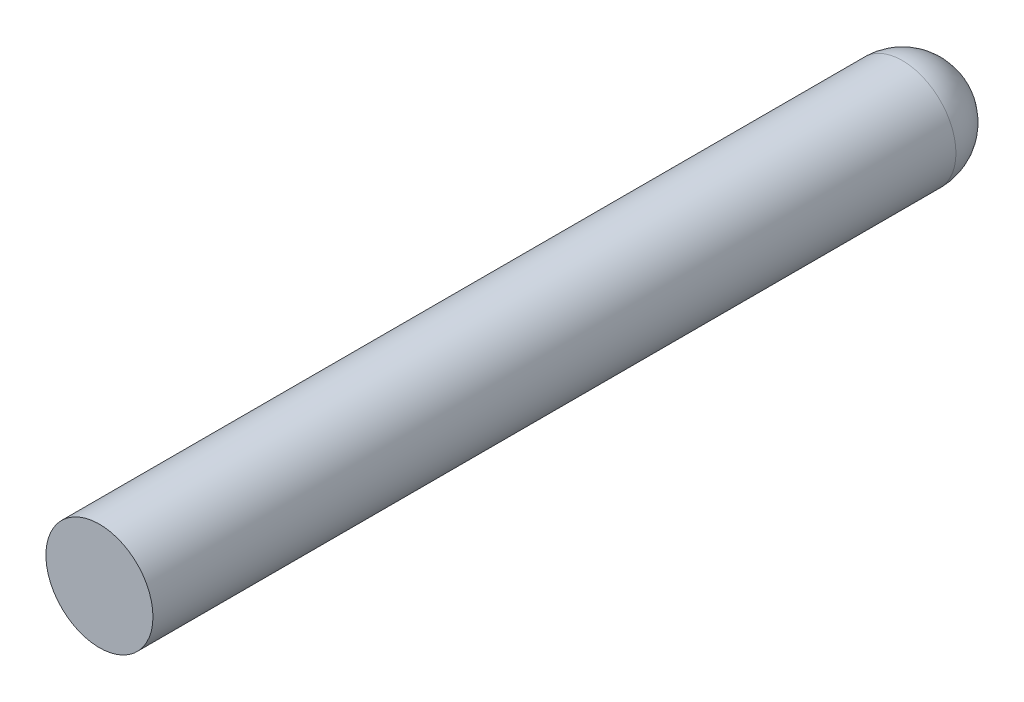
ISO-10303-21;
HEADER;
FILE_DESCRIPTION(('STEP AP214'),'2;1');
FILE_NAME('part.step','',(''),(''),'','','');
FILE_SCHEMA(('AUTOMOTIVE_DESIGN { 1 0 10303 214 1 1 1 1 }'));
ENDSEC;
DATA;
#1=APPLICATION_CONTEXT('core data for automotive mechanical design processes');
#2=APPLICATION_PROTOCOL_DEFINITION('international standard','automotive_design',2000,#1);
#3=PRODUCT_CONTEXT('',#1,'mechanical');
#4=PRODUCT('Part','Part','',(#3));
#5=PRODUCT_RELATED_PRODUCT_CATEGORY('part','',(#4));
#6=PRODUCT_DEFINITION_FORMATION('','',#4);
#7=PRODUCT_DEFINITION_CONTEXT('part definition',#1,'design');
#8=PRODUCT_DEFINITION('design','',#6,#7);
#9=PRODUCT_DEFINITION_SHAPE('','',#8);
#10=(LENGTH_UNIT() NAMED_UNIT(*) SI_UNIT(.MILLI.,.METRE.));
#11=(NAMED_UNIT(*) PLANE_ANGLE_UNIT() SI_UNIT($,.RADIAN.));
#12=(NAMED_UNIT(*) SI_UNIT($,.STERADIAN.) SOLID_ANGLE_UNIT());
#13=UNCERTAINTY_MEASURE_WITH_UNIT(LENGTH_MEASURE(1.E-05),#10,'distance_accuracy_value','');
#14=(GEOMETRIC_REPRESENTATION_CONTEXT(3) GLOBAL_UNCERTAINTY_ASSIGNED_CONTEXT((#13)) GLOBAL_UNIT_ASSIGNED_CONTEXT((#10,
#11,#12)) REPRESENTATION_CONTEXT('',''));
#15=CARTESIAN_POINT('',(0.,0.,0.));
#16=DIRECTION('',(0.,0.,1.));
#17=DIRECTION('',(1.,0.,0.));
#18=AXIS2_PLACEMENT_3D('',#15,#16,#17);
#19=CARTESIAN_POINT('',(0.,0.,381.));
#20=DIRECTION('',(0.,0.,-1.));
#21=DIRECTION('',(-1.,0.,0.));
#22=AXIS2_PLACEMENT_3D('',#19,#20,#21);
#23=CYLINDRICAL_SURFACE('',#22,25.4);
#24=CARTESIAN_POINT('',(0.,0.,381.));
#25=DIRECTION('',(0.,0.,1.));
#26=DIRECTION('',(1.,0.,0.));
#27=AXIS2_PLACEMENT_3D('',#24,#25,#26);
#28=CIRCLE('',#27,25.4);
#29=CARTESIAN_POINT('',(25.4,0.,381.));
#30=VERTEX_POINT('',#29);
#31=EDGE_CURVE('E10',#30,#30,#28,.T.);
#32=ORIENTED_EDGE('',*,*,#31,.F.);
#33=EDGE_LOOP('',(#32));
#34=FACE_BOUND('',#33,.T.);
#35=CARTESIAN_POINT('',(0.,0.,0.));
#36=DIRECTION('',(0.,0.,1.));
#37=DIRECTION('',(1.,0.,0.));
#38=AXIS2_PLACEMENT_3D('',#35,#36,#37);
#39=CIRCLE('',#38,25.4);
#40=CARTESIAN_POINT('',(25.4,0.,0.));
#41=VERTEX_POINT('',#40);
#42=EDGE_CURVE('E46',#41,#41,#39,.T.);
#43=ORIENTED_EDGE('',*,*,#42,.T.);
#44=EDGE_LOOP('',(#43));
#45=FACE_BOUND('',#44,.T.);
#46=ADVANCED_FACE('F39',(#34,#45),#23,.T.);
#47=CARTESIAN_POINT('',(0.,0.,381.));
#48=DIRECTION('',(0.,0.,1.));
#49=DIRECTION('',(1.,0.,0.));
#50=AXIS2_PLACEMENT_3D('',#47,#48,#49);
#51=PLANE('',#50);
#52=ORIENTED_EDGE('',*,*,#31,.T.);
#53=EDGE_LOOP('',(#52));
#54=FACE_BOUND('',#53,.T.);
#55=ADVANCED_FACE('F56',(#54),#51,.T.);
#56=CARTESIAN_POINT('',(0.,0.,0.));
#57=DIRECTION('',(0.,0.,1.));
#58=DIRECTION('',(-1.,0.,0.));
#59=AXIS2_PLACEMENT_3D('',#56,#57,#58);
#60=SPHERICAL_SURFACE('',#59,25.4);
#61=ORIENTED_EDGE('',*,*,#42,.F.);
#62=EDGE_LOOP('',(#61));
#63=FACE_BOUND('',#62,.T.);
#64=ADVANCED_FACE('F54',(#63),#60,.T.);
#65=CLOSED_SHELL('',(#46,#55,#64));
#66=MANIFOLD_SOLID_BREP('B2',#65);
#67=ADVANCED_BREP_SHAPE_REPRESENTATION('',(#18,#66),#14);
#68=SHAPE_DEFINITION_REPRESENTATION(#9,#67);
ENDSEC;
END-ISO-10303-21;
